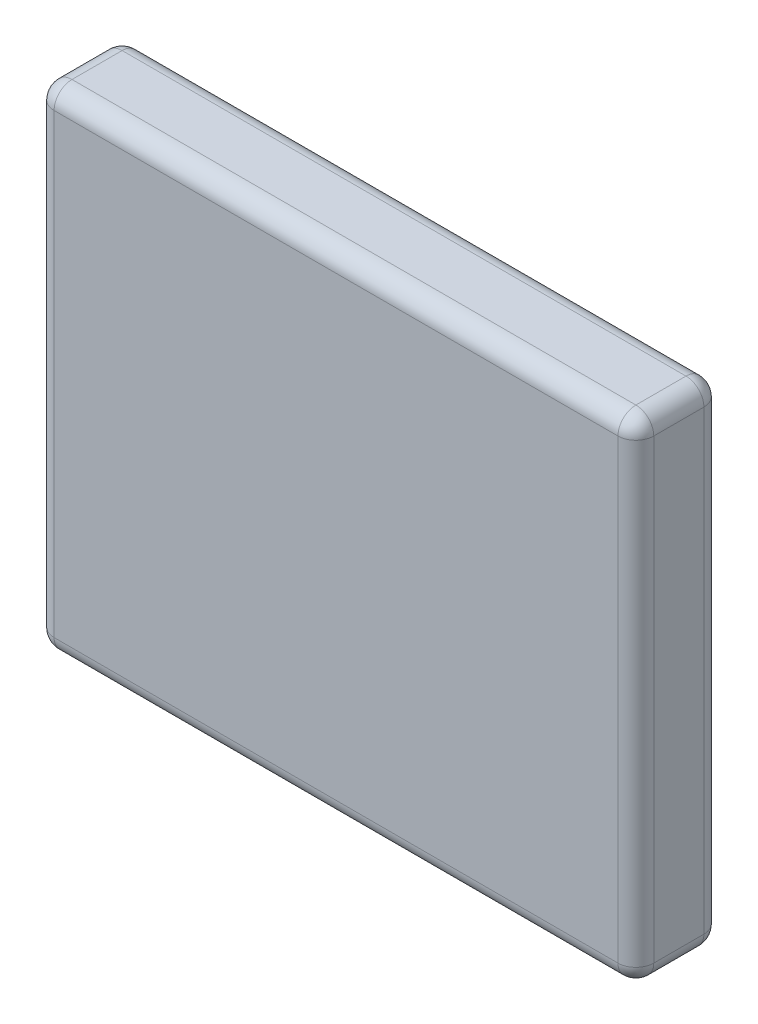
ISO-10303-21;
HEADER;
FILE_DESCRIPTION(('STEP AP214'),'2;1');
FILE_NAME('part.step','',(''),(''),'','','');
FILE_SCHEMA(('AUTOMOTIVE_DESIGN { 1 0 10303 214 1 1 1 1 }'));
ENDSEC;
DATA;
#1=APPLICATION_CONTEXT('core data for automotive mechanical design processes');
#2=APPLICATION_PROTOCOL_DEFINITION('international standard','automotive_design',2000,#1);
#3=PRODUCT_CONTEXT('',#1,'mechanical');
#4=PRODUCT('Part','Part','',(#3));
#5=PRODUCT_RELATED_PRODUCT_CATEGORY('part','',(#4));
#6=PRODUCT_DEFINITION_FORMATION('','',#4);
#7=PRODUCT_DEFINITION_CONTEXT('part definition',#1,'design');
#8=PRODUCT_DEFINITION('design','',#6,#7);
#9=PRODUCT_DEFINITION_SHAPE('','',#8);
#10=(LENGTH_UNIT() NAMED_UNIT(*) SI_UNIT(.MILLI.,.METRE.));
#11=(NAMED_UNIT(*) PLANE_ANGLE_UNIT() SI_UNIT($,.RADIAN.));
#12=(NAMED_UNIT(*) SI_UNIT($,.STERADIAN.) SOLID_ANGLE_UNIT());
#13=UNCERTAINTY_MEASURE_WITH_UNIT(LENGTH_MEASURE(1.E-05),#10,'distance_accuracy_value','');
#14=(GEOMETRIC_REPRESENTATION_CONTEXT(3) GLOBAL_UNCERTAINTY_ASSIGNED_CONTEXT((#13)) GLOBAL_UNIT_ASSIGNED_CONTEXT((#10,
#11,#12)) REPRESENTATION_CONTEXT('',''));
#15=CARTESIAN_POINT('',(0.,0.,0.));
#16=DIRECTION('',(0.,0.,1.));
#17=DIRECTION('',(1.,0.,0.));
#18=AXIS2_PLACEMENT_3D('',#15,#16,#17);
#19=CARTESIAN_POINT('',(33.5,27.5,9.6));
#20=DIRECTION('',(-1.,0.,0.));
#21=DIRECTION('',(0.,0.,1.));
#22=AXIS2_PLACEMENT_3D('',#19,#20,#21);
#23=PLANE('',#22);
#24=DIRECTION('',(0.,1.,0.));
#25=VECTOR('',#24,1.);
#26=CARTESIAN_POINT('',(33.5,-27.5,7.6));
#27=LINE('',#26,#25);
#28=CARTESIAN_POINT('',(33.5,25.5,7.6));
#29=VERTEX_POINT('',#28);
#30=CARTESIAN_POINT('',(33.5,-25.5,7.6));
#31=VERTEX_POINT('',#30);
#32=EDGE_CURVE('E223',#29,#31,#27,.F.);
#33=ORIENTED_EDGE('',*,*,#32,.T.);
#34=DIRECTION('',(0.,0.,-1.));
#35=VECTOR('',#34,1.);
#36=CARTESIAN_POINT('',(33.5,-25.5,9.6));
#37=LINE('',#36,#35);
#38=CARTESIAN_POINT('',(33.5,-25.5,2.));
#39=VERTEX_POINT('',#38);
#40=EDGE_CURVE('E234',#31,#39,#37,.T.);
#41=ORIENTED_EDGE('',*,*,#40,.T.);
#42=DIRECTION('',(0.,1.,0.));
#43=VECTOR('',#42,1.);
#44=CARTESIAN_POINT('',(33.5,27.5,2.));
#45=LINE('',#44,#43);
#46=CARTESIAN_POINT('',(33.5,25.5,2.));
#47=VERTEX_POINT('',#46);
#48=EDGE_CURVE('E227',#39,#47,#45,.T.);
#49=ORIENTED_EDGE('',*,*,#48,.T.);
#50=DIRECTION('',(0.,0.,-1.));
#51=VECTOR('',#50,1.);
#52=CARTESIAN_POINT('',(33.5,25.5,9.6));
#53=LINE('',#52,#51);
#54=EDGE_CURVE('E225',#47,#29,#53,.F.);
#55=ORIENTED_EDGE('',*,*,#54,.T.);
#56=EDGE_LOOP('',(#33,#41,#49,#55));
#57=FACE_BOUND('',#56,.T.);
#58=ADVANCED_FACE('F50',(#57),#23,.F.);
#59=CARTESIAN_POINT('',(-33.5,27.5,9.6));
#60=DIRECTION('',(0.,-1.,0.));
#61=DIRECTION('',(0.,0.,-1.));
#62=AXIS2_PLACEMENT_3D('',#59,#60,#61);
#63=PLANE('',#62);
#64=DIRECTION('',(-1.,0.,0.));
#65=VECTOR('',#64,1.);
#66=CARTESIAN_POINT('',(-33.5,27.5,2.));
#67=LINE('',#66,#65);
#68=CARTESIAN_POINT('',(31.5,27.5,2.));
#69=VERTEX_POINT('',#68);
#70=CARTESIAN_POINT('',(-31.5,27.5,2.));
#71=VERTEX_POINT('',#70);
#72=EDGE_CURVE('E146',#69,#71,#67,.T.);
#73=ORIENTED_EDGE('',*,*,#72,.T.);
#74=DIRECTION('',(0.,0.,-1.));
#75=VECTOR('',#74,1.);
#76=CARTESIAN_POINT('',(-31.5,27.5,9.6));
#77=LINE('',#76,#75);
#78=CARTESIAN_POINT('',(-31.5,27.5,7.6));
#79=VERTEX_POINT('',#78);
#80=EDGE_CURVE('E141',#71,#79,#77,.F.);
#81=ORIENTED_EDGE('',*,*,#80,.T.);
#82=DIRECTION('',(-1.,0.,0.));
#83=VECTOR('',#82,1.);
#84=CARTESIAN_POINT('',(33.5,27.5,7.6));
#85=LINE('',#84,#83);
#86=CARTESIAN_POINT('',(31.5,27.5,7.6));
#87=VERTEX_POINT('',#86);
#88=EDGE_CURVE('E134',#79,#87,#85,.F.);
#89=ORIENTED_EDGE('',*,*,#88,.T.);
#90=DIRECTION('',(0.,0.,-1.));
#91=VECTOR('',#90,1.);
#92=CARTESIAN_POINT('',(31.5,27.5,9.6));
#93=LINE('',#92,#91);
#94=EDGE_CURVE('E136',#87,#69,#93,.T.);
#95=ORIENTED_EDGE('',*,*,#94,.T.);
#96=EDGE_LOOP('',(#73,#81,#89,#95));
#97=FACE_BOUND('',#96,.T.);
#98=ADVANCED_FACE('F137',(#97),#63,.F.);
#99=CARTESIAN_POINT('',(-33.5,27.5,9.6));
#100=DIRECTION('',(1.,0.,0.));
#101=DIRECTION('',(0.,0.,-1.));
#102=AXIS2_PLACEMENT_3D('',#99,#100,#101);
#103=PLANE('',#102);
#104=DIRECTION('',(0.,-1.,0.));
#105=VECTOR('',#104,1.);
#106=CARTESIAN_POINT('',(-33.5,27.5,7.6));
#107=LINE('',#106,#105);
#108=CARTESIAN_POINT('',(-33.5,-25.5,7.6));
#109=VERTEX_POINT('',#108);
#110=CARTESIAN_POINT('',(-33.5,25.5,7.6));
#111=VERTEX_POINT('',#110);
#112=EDGE_CURVE('E200',#109,#111,#107,.F.);
#113=ORIENTED_EDGE('',*,*,#112,.T.);
#114=DIRECTION('',(0.,0.,-1.));
#115=VECTOR('',#114,1.);
#116=CARTESIAN_POINT('',(-33.5,25.5,9.6));
#117=LINE('',#116,#115);
#118=CARTESIAN_POINT('',(-33.5,25.5,2.));
#119=VERTEX_POINT('',#118);
#120=EDGE_CURVE('E206',#111,#119,#117,.T.);
#121=ORIENTED_EDGE('',*,*,#120,.T.);
#122=DIRECTION('',(0.,-1.,0.));
#123=VECTOR('',#122,1.);
#124=CARTESIAN_POINT('',(-33.5,27.5,2.));
#125=LINE('',#124,#123);
#126=CARTESIAN_POINT('',(-33.5,-25.5,2.));
#127=VERTEX_POINT('',#126);
#128=EDGE_CURVE('E205',#119,#127,#125,.T.);
#129=ORIENTED_EDGE('',*,*,#128,.T.);
#130=DIRECTION('',(0.,0.,-1.));
#131=VECTOR('',#130,1.);
#132=CARTESIAN_POINT('',(-33.5,-25.5,9.6));
#133=LINE('',#132,#131);
#134=EDGE_CURVE('E198',#127,#109,#133,.F.);
#135=ORIENTED_EDGE('',*,*,#134,.T.);
#136=EDGE_LOOP('',(#113,#121,#129,#135));
#137=FACE_BOUND('',#136,.T.);
#138=ADVANCED_FACE('F324',(#137),#103,.F.);
#139=CARTESIAN_POINT('',(-33.5,-27.5,9.6));
#140=DIRECTION('',(0.,1.,0.));
#141=DIRECTION('',(0.,0.,1.));
#142=AXIS2_PLACEMENT_3D('',#139,#140,#141);
#143=PLANE('',#142);
#144=DIRECTION('',(1.,0.,0.));
#145=VECTOR('',#144,1.);
#146=CARTESIAN_POINT('',(-33.5,-27.5,7.6));
#147=LINE('',#146,#145);
#148=CARTESIAN_POINT('',(31.5,-27.5,7.6));
#149=VERTEX_POINT('',#148);
#150=CARTESIAN_POINT('',(-31.5,-27.5,7.6));
#151=VERTEX_POINT('',#150);
#152=EDGE_CURVE('E215',#149,#151,#147,.F.);
#153=ORIENTED_EDGE('',*,*,#152,.T.);
#154=DIRECTION('',(0.,0.,-1.));
#155=VECTOR('',#154,1.);
#156=CARTESIAN_POINT('',(-31.5,-27.5,9.6));
#157=LINE('',#156,#155);
#158=CARTESIAN_POINT('',(-31.5,-27.5,2.));
#159=VERTEX_POINT('',#158);
#160=EDGE_CURVE('E218',#151,#159,#157,.T.);
#161=ORIENTED_EDGE('',*,*,#160,.T.);
#162=DIRECTION('',(1.,0.,0.));
#163=VECTOR('',#162,1.);
#164=CARTESIAN_POINT('',(-33.5,-27.5,2.));
#165=LINE('',#164,#163);
#166=CARTESIAN_POINT('',(31.5,-27.5,2.));
#167=VERTEX_POINT('',#166);
#168=EDGE_CURVE('E214',#159,#167,#165,.T.);
#169=ORIENTED_EDGE('',*,*,#168,.T.);
#170=DIRECTION('',(0.,0.,-1.));
#171=VECTOR('',#170,1.);
#172=CARTESIAN_POINT('',(31.5,-27.5,9.6));
#173=LINE('',#172,#171);
#174=EDGE_CURVE('E207',#167,#149,#173,.F.);
#175=ORIENTED_EDGE('',*,*,#174,.T.);
#176=EDGE_LOOP('',(#153,#161,#169,#175));
#177=FACE_BOUND('',#176,.T.);
#178=ADVANCED_FACE('F331',(#177),#143,.F.);
#179=CARTESIAN_POINT('',(0.,0.,9.6));
#180=DIRECTION('',(0.,0.,1.));
#181=DIRECTION('',(1.,0.,0.));
#182=AXIS2_PLACEMENT_3D('',#179,#180,#181);
#183=PLANE('',#182);
#184=DIRECTION('',(0.,-1.,0.));
#185=VECTOR('',#184,1.);
#186=CARTESIAN_POINT('',(-31.5,-27.5,9.6));
#187=LINE('',#186,#185);
#188=CARTESIAN_POINT('',(-31.5,25.5,9.6));
#189=VERTEX_POINT('',#188);
#190=CARTESIAN_POINT('',(-31.5,-25.5,9.6));
#191=VERTEX_POINT('',#190);
#192=EDGE_CURVE('E60',#189,#191,#187,.T.);
#193=ORIENTED_EDGE('',*,*,#192,.T.);
#194=DIRECTION('',(1.,0.,0.));
#195=VECTOR('',#194,1.);
#196=CARTESIAN_POINT('',(33.5,-25.5,9.6));
#197=LINE('',#196,#195);
#198=CARTESIAN_POINT('',(31.5,-25.5,9.6));
#199=VERTEX_POINT('',#198);
#200=EDGE_CURVE('E11',#191,#199,#197,.T.);
#201=ORIENTED_EDGE('',*,*,#200,.T.);
#202=DIRECTION('',(0.,1.,0.));
#203=VECTOR('',#202,1.);
#204=CARTESIAN_POINT('',(31.5,27.5,9.6));
#205=LINE('',#204,#203);
#206=CARTESIAN_POINT('',(31.5,25.5,9.6));
#207=VERTEX_POINT('',#206);
#208=EDGE_CURVE('E231',#199,#207,#205,.T.);
#209=ORIENTED_EDGE('',*,*,#208,.T.);
#210=DIRECTION('',(-1.,0.,0.));
#211=VECTOR('',#210,1.);
#212=CARTESIAN_POINT('',(-33.5,25.5,9.6));
#213=LINE('',#212,#211);
#214=EDGE_CURVE('E67',#207,#189,#213,.T.);
#215=ORIENTED_EDGE('',*,*,#214,.T.);
#216=EDGE_LOOP('',(#193,#201,#209,#215));
#217=FACE_BOUND('',#216,.T.);
#218=ADVANCED_FACE('F358',(#217),#183,.T.);
#219=CARTESIAN_POINT('',(0.,0.,0.));
#220=DIRECTION('',(0.,0.,1.));
#221=DIRECTION('',(1.,0.,0.));
#222=AXIS2_PLACEMENT_3D('',#219,#220,#221);
#223=PLANE('',#222);
#224=DIRECTION('',(0.,-1.,0.));
#225=VECTOR('',#224,1.);
#226=CARTESIAN_POINT('',(-31.5,0.,0.));
#227=LINE('',#226,#225);
#228=CARTESIAN_POINT('',(-31.5,-25.5,0.));
#229=VERTEX_POINT('',#228);
#230=CARTESIAN_POINT('',(-31.5,25.5,0.));
#231=VERTEX_POINT('',#230);
#232=EDGE_CURVE('E188',#229,#231,#227,.F.);
#233=ORIENTED_EDGE('',*,*,#232,.T.);
#234=DIRECTION('',(-1.,0.,0.));
#235=VECTOR('',#234,1.);
#236=CARTESIAN_POINT('',(0.,25.5,0.));
#237=LINE('',#236,#235);
#238=CARTESIAN_POINT('',(31.5,25.5,0.));
#239=VERTEX_POINT('',#238);
#240=EDGE_CURVE('E194',#231,#239,#237,.F.);
#241=ORIENTED_EDGE('',*,*,#240,.T.);
#242=DIRECTION('',(0.,1.,0.));
#243=VECTOR('',#242,1.);
#244=CARTESIAN_POINT('',(31.5,0.,0.));
#245=LINE('',#244,#243);
#246=CARTESIAN_POINT('',(31.5,-25.5,0.));
#247=VERTEX_POINT('',#246);
#248=EDGE_CURVE('E181',#239,#247,#245,.F.);
#249=ORIENTED_EDGE('',*,*,#248,.T.);
#250=DIRECTION('',(1.,0.,0.));
#251=VECTOR('',#250,1.);
#252=CARTESIAN_POINT('',(0.,-25.5,0.));
#253=LINE('',#252,#251);
#254=EDGE_CURVE('E186',#247,#229,#253,.F.);
#255=ORIENTED_EDGE('',*,*,#254,.T.);
#256=EDGE_LOOP('',(#233,#241,#249,#255));
#257=FACE_BOUND('',#256,.T.);
#258=ADVANCED_FACE('F357',(#257),#223,.F.);
#259=CARTESIAN_POINT('',(0.,-25.5,7.6));
#260=DIRECTION('',(-1.,0.,0.));
#261=DIRECTION('',(0.,0.,1.));
#262=AXIS2_PLACEMENT_3D('',#259,#260,#261);
#263=CYLINDRICAL_SURFACE('',#262,2.);
#264=CARTESIAN_POINT('',(31.5,-25.5,7.6));
#265=DIRECTION('',(1.,0.,0.));
#266=DIRECTION('',(0.,0.,-1.));
#267=AXIS2_PLACEMENT_3D('',#264,#265,#266);
#268=CIRCLE('',#267,2.);
#269=EDGE_CURVE('E51',#199,#149,#268,.T.);
#270=ORIENTED_EDGE('',*,*,#269,.F.);
#271=ORIENTED_EDGE('',*,*,#200,.F.);
#272=CARTESIAN_POINT('',(-31.5,-25.5,7.6));
#273=DIRECTION('',(-1.,0.,0.));
#274=DIRECTION('',(0.,0.,1.));
#275=AXIS2_PLACEMENT_3D('',#272,#273,#274);
#276=CIRCLE('',#275,2.);
#277=EDGE_CURVE('E179',#151,#191,#276,.T.);
#278=ORIENTED_EDGE('',*,*,#277,.F.);
#279=ORIENTED_EDGE('',*,*,#152,.F.);
#280=EDGE_LOOP('',(#270,#271,#278,#279));
#281=FACE_BOUND('',#280,.T.);
#282=ADVANCED_FACE('F47',(#281),#263,.T.);
#283=CARTESIAN_POINT('',(31.5,-25.5,7.6));
#284=DIRECTION('',(0.,-1.,0.));
#285=DIRECTION('',(0.,0.,-1.));
#286=AXIS2_PLACEMENT_3D('',#283,#284,#285);
#287=SPHERICAL_SURFACE('',#286,2.);
#288=CARTESIAN_POINT('',(31.5,-25.5,7.6));
#289=DIRECTION('',(0.,-1.,0.));
#290=DIRECTION('',(0.,0.,-1.));
#291=AXIS2_PLACEMENT_3D('',#288,#289,#290);
#292=CIRCLE('',#291,2.);
#293=EDGE_CURVE('E304',#199,#31,#292,.F.);
#294=ORIENTED_EDGE('',*,*,#293,.F.);
#295=ORIENTED_EDGE('',*,*,#269,.T.);
#296=CARTESIAN_POINT('',(31.5,-25.5,7.6));
#297=DIRECTION('',(0.,0.,1.));
#298=DIRECTION('',(1.,0.,0.));
#299=AXIS2_PLACEMENT_3D('',#296,#297,#298);
#300=CIRCLE('',#299,2.);
#301=EDGE_CURVE('E308',#31,#149,#300,.F.);
#302=ORIENTED_EDGE('',*,*,#301,.F.);
#303=EDGE_LOOP('',(#294,#295,#302));
#304=FACE_BOUND('',#303,.T.);
#305=ADVANCED_FACE('F355',(#304),#287,.T.);
#306=CARTESIAN_POINT('',(-31.5,-25.5,7.6));
#307=DIRECTION('',(0.,0.,1.));
#308=DIRECTION('',(1.,0.,0.));
#309=AXIS2_PLACEMENT_3D('',#306,#307,#308);
#310=SPHERICAL_SURFACE('',#309,2.);
#311=CARTESIAN_POINT('',(-31.5,-25.5,7.6));
#312=DIRECTION('',(0.,0.,1.));
#313=DIRECTION('',(1.,0.,0.));
#314=AXIS2_PLACEMENT_3D('',#311,#312,#313);
#315=CIRCLE('',#314,2.);
#316=EDGE_CURVE('E294',#151,#109,#315,.F.);
#317=ORIENTED_EDGE('',*,*,#316,.F.);
#318=ORIENTED_EDGE('',*,*,#277,.T.);
#319=CARTESIAN_POINT('',(-31.5,-25.5,7.6));
#320=DIRECTION('',(0.,-1.,0.));
#321=DIRECTION('',(0.,0.,-1.));
#322=AXIS2_PLACEMENT_3D('',#319,#320,#321);
#323=CIRCLE('',#322,2.);
#324=EDGE_CURVE('E297',#109,#191,#323,.F.);
#325=ORIENTED_EDGE('',*,*,#324,.F.);
#326=EDGE_LOOP('',(#317,#318,#325));
#327=FACE_BOUND('',#326,.T.);
#328=ADVANCED_FACE('F312',(#327),#310,.T.);
#329=CARTESIAN_POINT('',(31.5,-25.5,9.6));
#330=DIRECTION('',(0.,0.,-1.));
#331=DIRECTION('',(-1.,0.,0.));
#332=AXIS2_PLACEMENT_3D('',#329,#330,#331);
#333=CYLINDRICAL_SURFACE('',#332,2.);
#334=ORIENTED_EDGE('',*,*,#301,.T.);
#335=ORIENTED_EDGE('',*,*,#174,.F.);
#336=CARTESIAN_POINT('',(31.5,-25.5,2.));
#337=DIRECTION('',(0.,0.,-1.));
#338=DIRECTION('',(-1.,0.,0.));
#339=AXIS2_PLACEMENT_3D('',#336,#337,#338);
#340=CIRCLE('',#339,2.);
#341=EDGE_CURVE('E289',#39,#167,#340,.T.);
#342=ORIENTED_EDGE('',*,*,#341,.F.);
#343=ORIENTED_EDGE('',*,*,#40,.F.);
#344=EDGE_LOOP('',(#334,#335,#342,#343));
#345=FACE_BOUND('',#344,.T.);
#346=ADVANCED_FACE('F347',(#345),#333,.T.);
#347=CARTESIAN_POINT('',(31.5,0.,7.6));
#348=DIRECTION('',(0.,-1.,0.));
#349=DIRECTION('',(0.,0.,-1.));
#350=AXIS2_PLACEMENT_3D('',#347,#348,#349);
#351=CYLINDRICAL_SURFACE('',#350,2.);
#352=ORIENTED_EDGE('',*,*,#293,.T.);
#353=ORIENTED_EDGE('',*,*,#32,.F.);
#354=CARTESIAN_POINT('',(31.5,25.5,7.6));
#355=DIRECTION('',(0.,1.,0.));
#356=DIRECTION('',(0.,0.,1.));
#357=AXIS2_PLACEMENT_3D('',#354,#355,#356);
#358=CIRCLE('',#357,2.);
#359=EDGE_CURVE('E158',#207,#29,#358,.T.);
#360=ORIENTED_EDGE('',*,*,#359,.F.);
#361=ORIENTED_EDGE('',*,*,#208,.F.);
#362=EDGE_LOOP('',(#352,#353,#360,#361));
#363=FACE_BOUND('',#362,.T.);
#364=ADVANCED_FACE('F354',(#363),#351,.T.);
#365=CARTESIAN_POINT('',(0.,25.5,7.6));
#366=DIRECTION('',(1.,0.,0.));
#367=DIRECTION('',(0.,0.,-1.));
#368=AXIS2_PLACEMENT_3D('',#365,#366,#367);
#369=CYLINDRICAL_SURFACE('',#368,2.);
#370=CARTESIAN_POINT('',(-31.5,25.5,7.6));
#371=DIRECTION('',(-1.,0.,0.));
#372=DIRECTION('',(0.,0.,1.));
#373=AXIS2_PLACEMENT_3D('',#370,#371,#372);
#374=CIRCLE('',#373,2.);
#375=EDGE_CURVE('E157',#189,#79,#374,.T.);
#376=ORIENTED_EDGE('',*,*,#375,.F.);
#377=ORIENTED_EDGE('',*,*,#214,.F.);
#378=CARTESIAN_POINT('',(31.5,25.5,7.6));
#379=DIRECTION('',(1.,0.,0.));
#380=DIRECTION('',(0.,0.,-1.));
#381=AXIS2_PLACEMENT_3D('',#378,#379,#380);
#382=CIRCLE('',#381,2.);
#383=EDGE_CURVE('E151',#87,#207,#382,.T.);
#384=ORIENTED_EDGE('',*,*,#383,.F.);
#385=ORIENTED_EDGE('',*,*,#88,.F.);
#386=EDGE_LOOP('',(#376,#377,#384,#385));
#387=FACE_BOUND('',#386,.T.);
#388=ADVANCED_FACE('F153',(#387),#369,.T.);
#389=CARTESIAN_POINT('',(-31.5,0.,7.6));
#390=DIRECTION('',(0.,1.,0.));
#391=DIRECTION('',(0.,0.,1.));
#392=AXIS2_PLACEMENT_3D('',#389,#390,#391);
#393=CYLINDRICAL_SURFACE('',#392,2.);
#394=ORIENTED_EDGE('',*,*,#324,.T.);
#395=ORIENTED_EDGE('',*,*,#192,.F.);
#396=CARTESIAN_POINT('',(-31.5,25.5,7.6));
#397=DIRECTION('',(0.,1.,0.));
#398=DIRECTION('',(0.,0.,1.));
#399=AXIS2_PLACEMENT_3D('',#396,#397,#398);
#400=CIRCLE('',#399,2.);
#401=EDGE_CURVE('E276',#111,#189,#400,.T.);
#402=ORIENTED_EDGE('',*,*,#401,.F.);
#403=ORIENTED_EDGE('',*,*,#112,.F.);
#404=EDGE_LOOP('',(#394,#395,#402,#403));
#405=FACE_BOUND('',#404,.T.);
#406=ADVANCED_FACE('F321',(#405),#393,.T.);
#407=CARTESIAN_POINT('',(-31.5,-25.5,9.6));
#408=DIRECTION('',(0.,0.,-1.));
#409=DIRECTION('',(-1.,0.,0.));
#410=AXIS2_PLACEMENT_3D('',#407,#408,#409);
#411=CYLINDRICAL_SURFACE('',#410,2.);
#412=ORIENTED_EDGE('',*,*,#316,.T.);
#413=ORIENTED_EDGE('',*,*,#134,.F.);
#414=CARTESIAN_POINT('',(-31.5,-25.5,2.));
#415=DIRECTION('',(0.,0.,-1.));
#416=DIRECTION('',(-1.,0.,0.));
#417=AXIS2_PLACEMENT_3D('',#414,#415,#416);
#418=CIRCLE('',#417,2.);
#419=EDGE_CURVE('E274',#159,#127,#418,.T.);
#420=ORIENTED_EDGE('',*,*,#419,.F.);
#421=ORIENTED_EDGE('',*,*,#160,.F.);
#422=EDGE_LOOP('',(#412,#413,#420,#421));
#423=FACE_BOUND('',#422,.T.);
#424=ADVANCED_FACE('F332',(#423),#411,.T.);
#425=CARTESIAN_POINT('',(-33.5,-25.5,2.));
#426=DIRECTION('',(1.,0.,0.));
#427=DIRECTION('',(0.,0.,-1.));
#428=AXIS2_PLACEMENT_3D('',#425,#426,#427);
#429=CYLINDRICAL_SURFACE('',#428,2.);
#430=CARTESIAN_POINT('',(31.5,-25.5,2.));
#431=DIRECTION('',(1.,0.,0.));
#432=DIRECTION('',(0.,0.,-1.));
#433=AXIS2_PLACEMENT_3D('',#430,#431,#432);
#434=CIRCLE('',#433,2.);
#435=EDGE_CURVE('E286',#167,#247,#434,.T.);
#436=ORIENTED_EDGE('',*,*,#435,.F.);
#437=ORIENTED_EDGE('',*,*,#168,.F.);
#438=CARTESIAN_POINT('',(-31.5,-25.5,2.));
#439=DIRECTION('',(-1.,0.,0.));
#440=DIRECTION('',(0.,0.,1.));
#441=AXIS2_PLACEMENT_3D('',#438,#439,#440);
#442=CIRCLE('',#441,2.);
#443=EDGE_CURVE('E271',#229,#159,#442,.T.);
#444=ORIENTED_EDGE('',*,*,#443,.F.);
#445=ORIENTED_EDGE('',*,*,#254,.F.);
#446=EDGE_LOOP('',(#436,#437,#444,#445));
#447=FACE_BOUND('',#446,.T.);
#448=ADVANCED_FACE('F337',(#447),#429,.T.);
#449=CARTESIAN_POINT('',(31.5,-25.5,2.));
#450=DIRECTION('',(0.,-1.,0.));
#451=DIRECTION('',(0.,0.,-1.));
#452=AXIS2_PLACEMENT_3D('',#449,#450,#451);
#453=SPHERICAL_SURFACE('',#452,2.);
#454=ORIENTED_EDGE('',*,*,#341,.T.);
#455=ORIENTED_EDGE('',*,*,#435,.T.);
#456=CARTESIAN_POINT('',(31.5,-25.5,2.));
#457=DIRECTION('',(0.,-1.,0.));
#458=DIRECTION('',(1.,0.,0.));
#459=AXIS2_PLACEMENT_3D('',#456,#457,#458);
#460=CIRCLE('',#459,2.);
#461=EDGE_CURVE('E170',#39,#247,#460,.F.);
#462=ORIENTED_EDGE('',*,*,#461,.F.);
#463=EDGE_LOOP('',(#454,#455,#462));
#464=FACE_BOUND('',#463,.T.);
#465=ADVANCED_FACE('F414',(#464),#453,.T.);
#466=CARTESIAN_POINT('',(31.5,25.5,7.6));
#467=DIRECTION('',(0.,0.,1.));
#468=DIRECTION('',(1.,0.,0.));
#469=AXIS2_PLACEMENT_3D('',#466,#467,#468);
#470=SPHERICAL_SURFACE('',#469,2.);
#471=ORIENTED_EDGE('',*,*,#383,.T.);
#472=ORIENTED_EDGE('',*,*,#359,.T.);
#473=CARTESIAN_POINT('',(31.5,25.5,7.6));
#474=DIRECTION('',(0.,0.,1.));
#475=DIRECTION('',(1.,0.,0.));
#476=AXIS2_PLACEMENT_3D('',#473,#474,#475);
#477=CIRCLE('',#476,2.);
#478=EDGE_CURVE('E165',#87,#29,#477,.F.);
#479=ORIENTED_EDGE('',*,*,#478,.F.);
#480=EDGE_LOOP('',(#471,#472,#479));
#481=FACE_BOUND('',#480,.T.);
#482=ADVANCED_FACE('F162',(#481),#470,.T.);
#483=CARTESIAN_POINT('',(-31.5,25.5,7.6));
#484=DIRECTION('',(0.,0.,1.));
#485=DIRECTION('',(1.,0.,0.));
#486=AXIS2_PLACEMENT_3D('',#483,#484,#485);
#487=SPHERICAL_SURFACE('',#486,2.);
#488=ORIENTED_EDGE('',*,*,#401,.T.);
#489=ORIENTED_EDGE('',*,*,#375,.T.);
#490=CARTESIAN_POINT('',(-31.5,25.5,7.6));
#491=DIRECTION('',(0.,0.,1.));
#492=DIRECTION('',(1.,0.,0.));
#493=AXIS2_PLACEMENT_3D('',#490,#491,#492);
#494=CIRCLE('',#493,2.);
#495=EDGE_CURVE('E169',#111,#79,#494,.F.);
#496=ORIENTED_EDGE('',*,*,#495,.F.);
#497=EDGE_LOOP('',(#488,#489,#496));
#498=FACE_BOUND('',#497,.T.);
#499=ADVANCED_FACE('F403',(#498),#487,.T.);
#500=CARTESIAN_POINT('',(-31.5,-25.5,2.));
#501=DIRECTION('',(0.,-1.,0.));
#502=DIRECTION('',(0.,0.,-1.));
#503=AXIS2_PLACEMENT_3D('',#500,#501,#502);
#504=SPHERICAL_SURFACE('',#503,2.);
#505=ORIENTED_EDGE('',*,*,#443,.T.);
#506=ORIENTED_EDGE('',*,*,#419,.T.);
#507=CARTESIAN_POINT('',(-31.5,-25.5,2.));
#508=DIRECTION('',(0.,-1.,0.));
#509=DIRECTION('',(0.,0.,-1.));
#510=AXIS2_PLACEMENT_3D('',#507,#508,#509);
#511=CIRCLE('',#510,2.);
#512=EDGE_CURVE('E265',#229,#127,#511,.F.);
#513=ORIENTED_EDGE('',*,*,#512,.F.);
#514=EDGE_LOOP('',(#505,#506,#513));
#515=FACE_BOUND('',#514,.T.);
#516=ADVANCED_FACE('F402',(#515),#504,.T.);
#517=CARTESIAN_POINT('',(31.5,27.5,2.));
#518=DIRECTION('',(0.,1.,0.));
#519=DIRECTION('',(0.,0.,1.));
#520=AXIS2_PLACEMENT_3D('',#517,#518,#519);
#521=CYLINDRICAL_SURFACE('',#520,2.);
#522=ORIENTED_EDGE('',*,*,#461,.T.);
#523=ORIENTED_EDGE('',*,*,#248,.F.);
#524=CARTESIAN_POINT('',(31.5,25.5,2.));
#525=DIRECTION('',(0.,1.,0.));
#526=DIRECTION('',(0.,0.,1.));
#527=AXIS2_PLACEMENT_3D('',#524,#525,#526);
#528=CIRCLE('',#527,2.);
#529=EDGE_CURVE('E256',#47,#239,#528,.T.);
#530=ORIENTED_EDGE('',*,*,#529,.F.);
#531=ORIENTED_EDGE('',*,*,#48,.F.);
#532=EDGE_LOOP('',(#522,#523,#530,#531));
#533=FACE_BOUND('',#532,.T.);
#534=ADVANCED_FACE('F397',(#533),#521,.T.);
#535=CARTESIAN_POINT('',(31.5,25.5,9.6));
#536=DIRECTION('',(0.,0.,-1.));
#537=DIRECTION('',(-1.,0.,0.));
#538=AXIS2_PLACEMENT_3D('',#535,#536,#537);
#539=CYLINDRICAL_SURFACE('',#538,2.);
#540=ORIENTED_EDGE('',*,*,#478,.T.);
#541=ORIENTED_EDGE('',*,*,#54,.F.);
#542=CARTESIAN_POINT('',(31.5,25.5,2.));
#543=DIRECTION('',(0.,0.,-1.));
#544=DIRECTION('',(-1.,0.,0.));
#545=AXIS2_PLACEMENT_3D('',#542,#543,#544);
#546=CIRCLE('',#545,2.);
#547=EDGE_CURVE('E171',#69,#47,#546,.T.);
#548=ORIENTED_EDGE('',*,*,#547,.F.);
#549=ORIENTED_EDGE('',*,*,#94,.F.);
#550=EDGE_LOOP('',(#540,#541,#548,#549));
#551=FACE_BOUND('',#550,.T.);
#552=ADVANCED_FACE('F168',(#551),#539,.T.);
#553=CARTESIAN_POINT('',(-31.5,25.5,9.6));
#554=DIRECTION('',(0.,0.,-1.));
#555=DIRECTION('',(-1.,0.,0.));
#556=AXIS2_PLACEMENT_3D('',#553,#554,#555);
#557=CYLINDRICAL_SURFACE('',#556,2.);
#558=ORIENTED_EDGE('',*,*,#495,.T.);
#559=ORIENTED_EDGE('',*,*,#80,.F.);
#560=CARTESIAN_POINT('',(-31.5,25.5,2.));
#561=DIRECTION('',(0.,0.,-1.));
#562=DIRECTION('',(-1.,0.,0.));
#563=AXIS2_PLACEMENT_3D('',#560,#561,#562);
#564=CIRCLE('',#563,2.);
#565=EDGE_CURVE('E252',#119,#71,#564,.T.);
#566=ORIENTED_EDGE('',*,*,#565,.F.);
#567=ORIENTED_EDGE('',*,*,#120,.F.);
#568=EDGE_LOOP('',(#558,#559,#566,#567));
#569=FACE_BOUND('',#568,.T.);
#570=ADVANCED_FACE('F391',(#569),#557,.T.);
#571=CARTESIAN_POINT('',(-31.5,27.5,2.));
#572=DIRECTION('',(0.,-1.,0.));
#573=DIRECTION('',(0.,0.,-1.));
#574=AXIS2_PLACEMENT_3D('',#571,#572,#573);
#575=CYLINDRICAL_SURFACE('',#574,2.);
#576=ORIENTED_EDGE('',*,*,#512,.T.);
#577=ORIENTED_EDGE('',*,*,#128,.F.);
#578=CARTESIAN_POINT('',(-31.5,25.5,2.));
#579=DIRECTION('',(0.,1.,0.));
#580=DIRECTION('',(0.,0.,1.));
#581=AXIS2_PLACEMENT_3D('',#578,#579,#580);
#582=CIRCLE('',#581,2.);
#583=EDGE_CURVE('E247',#231,#119,#582,.T.);
#584=ORIENTED_EDGE('',*,*,#583,.F.);
#585=ORIENTED_EDGE('',*,*,#232,.F.);
#586=EDGE_LOOP('',(#576,#577,#584,#585));
#587=FACE_BOUND('',#586,.T.);
#588=ADVANCED_FACE('F390',(#587),#575,.T.);
#589=CARTESIAN_POINT('',(31.5,25.5,2.));
#590=DIRECTION('',(1.,0.,0.));
#591=DIRECTION('',(0.,0.,-1.));
#592=AXIS2_PLACEMENT_3D('',#589,#590,#591);
#593=SPHERICAL_SURFACE('',#592,2.);
#594=ORIENTED_EDGE('',*,*,#547,.T.);
#595=ORIENTED_EDGE('',*,*,#529,.T.);
#596=CARTESIAN_POINT('',(31.5,25.5,2.));
#597=DIRECTION('',(1.,0.,0.));
#598=DIRECTION('',(0.,0.,-1.));
#599=AXIS2_PLACEMENT_3D('',#596,#597,#598);
#600=CIRCLE('',#599,2.);
#601=EDGE_CURVE('E244',#69,#239,#600,.F.);
#602=ORIENTED_EDGE('',*,*,#601,.F.);
#603=EDGE_LOOP('',(#594,#595,#602));
#604=FACE_BOUND('',#603,.T.);
#605=ADVANCED_FACE('F382',(#604),#593,.T.);
#606=CARTESIAN_POINT('',(-31.5,25.5,2.));
#607=DIRECTION('',(-1.,0.,0.));
#608=DIRECTION('',(0.,0.,1.));
#609=AXIS2_PLACEMENT_3D('',#606,#607,#608);
#610=SPHERICAL_SURFACE('',#609,2.);
#611=ORIENTED_EDGE('',*,*,#583,.T.);
#612=ORIENTED_EDGE('',*,*,#565,.T.);
#613=CARTESIAN_POINT('',(-31.5,25.5,2.));
#614=DIRECTION('',(-1.,0.,0.));
#615=DIRECTION('',(0.,0.,1.));
#616=AXIS2_PLACEMENT_3D('',#613,#614,#615);
#617=CIRCLE('',#616,2.);
#618=EDGE_CURVE('E245',#231,#71,#617,.F.);
#619=ORIENTED_EDGE('',*,*,#618,.F.);
#620=EDGE_LOOP('',(#611,#612,#619));
#621=FACE_BOUND('',#620,.T.);
#622=ADVANCED_FACE('F377',(#621),#610,.T.);
#623=CARTESIAN_POINT('',(-33.5,25.5,2.));
#624=DIRECTION('',(-1.,0.,0.));
#625=DIRECTION('',(0.,0.,1.));
#626=AXIS2_PLACEMENT_3D('',#623,#624,#625);
#627=CYLINDRICAL_SURFACE('',#626,2.);
#628=ORIENTED_EDGE('',*,*,#601,.T.);
#629=ORIENTED_EDGE('',*,*,#240,.F.);
#630=ORIENTED_EDGE('',*,*,#618,.T.);
#631=ORIENTED_EDGE('',*,*,#72,.F.);
#632=EDGE_LOOP('',(#628,#629,#630,#631));
#633=FACE_BOUND('',#632,.T.);
#634=ADVANCED_FACE('F376',(#633),#627,.T.);
#635=CLOSED_SHELL('',(#58,#98,#138,#178,#218,#258,#282,#305,#328,#346,#364,#388,#406,#424,#448,
#465,#482,#499,#516,#534,#552,#570,#588,#605,#622,#634));
#636=MANIFOLD_SOLID_BREP('B2',#635);
#637=ADVANCED_BREP_SHAPE_REPRESENTATION('',(#18,#636),#14);
#638=SHAPE_DEFINITION_REPRESENTATION(#9,#637);
ENDSEC;
END-ISO-10303-21;
